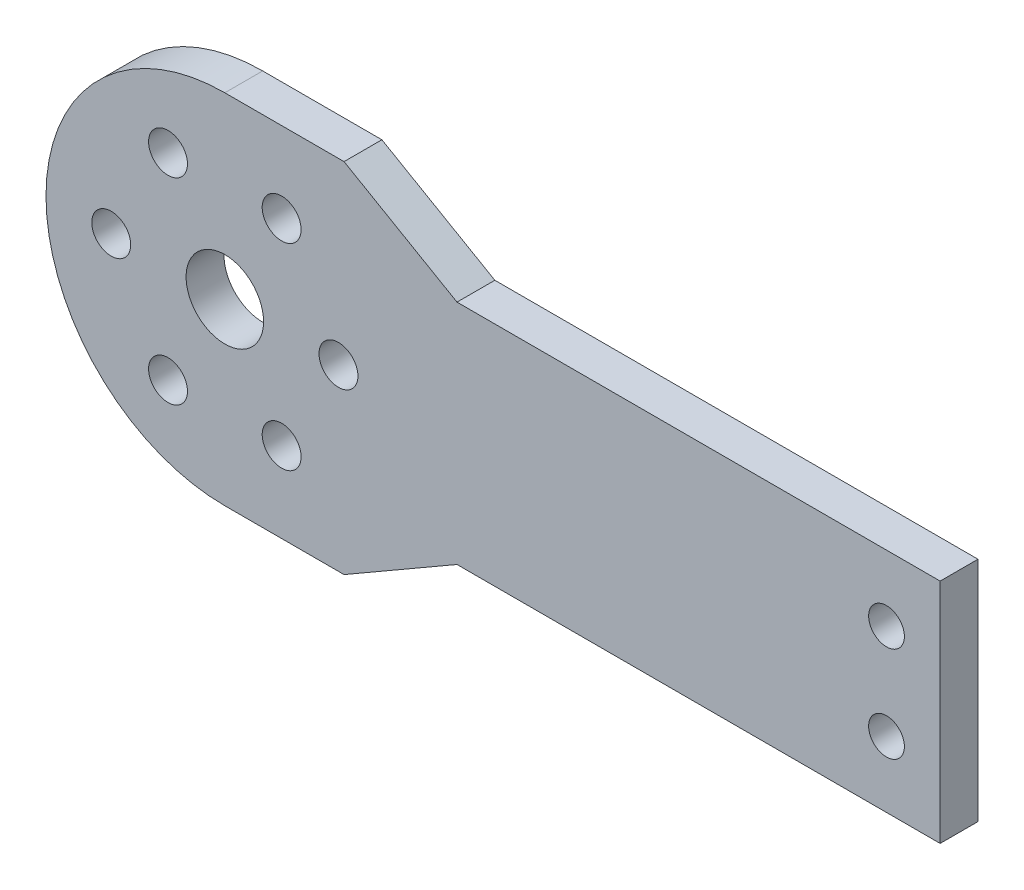
ISO-10303-21;
HEADER;
FILE_DESCRIPTION(('STEP AP214'),'2;1');
FILE_NAME('part.step','',(''),(''),'','','');
FILE_SCHEMA(('AUTOMOTIVE_DESIGN { 1 0 10303 214 1 1 1 1 }'));
ENDSEC;
DATA;
#1=APPLICATION_CONTEXT('core data for automotive mechanical design processes');
#2=APPLICATION_PROTOCOL_DEFINITION('international standard','automotive_design',2000,#1);
#3=PRODUCT_CONTEXT('',#1,'mechanical');
#4=PRODUCT('Part','Part','',(#3));
#5=PRODUCT_RELATED_PRODUCT_CATEGORY('part','',(#4));
#6=PRODUCT_DEFINITION_FORMATION('','',#4);
#7=PRODUCT_DEFINITION_CONTEXT('part definition',#1,'design');
#8=PRODUCT_DEFINITION('design','',#6,#7);
#9=PRODUCT_DEFINITION_SHAPE('','',#8);
#10=(LENGTH_UNIT() NAMED_UNIT(*) SI_UNIT(.MILLI.,.METRE.));
#11=(NAMED_UNIT(*) PLANE_ANGLE_UNIT() SI_UNIT($,.RADIAN.));
#12=(NAMED_UNIT(*) SI_UNIT($,.STERADIAN.) SOLID_ANGLE_UNIT());
#13=UNCERTAINTY_MEASURE_WITH_UNIT(LENGTH_MEASURE(1.E-05),#10,'distance_accuracy_value','');
#14=(GEOMETRIC_REPRESENTATION_CONTEXT(3) GLOBAL_UNCERTAINTY_ASSIGNED_CONTEXT((#13)) GLOBAL_UNIT_ASSIGNED_CONTEXT((#10,
#11,#12)) REPRESENTATION_CONTEXT('',''));
#15=CARTESIAN_POINT('',(0.,0.,0.));
#16=DIRECTION('',(0.,0.,1.));
#17=DIRECTION('',(1.,0.,0.));
#18=AXIS2_PLACEMENT_3D('',#15,#16,#17);
#19=CARTESIAN_POINT('',(0.,0.,89.3789074823255));
#20=DIRECTION('',(0.,0.,1.));
#21=DIRECTION('',(1.,0.,0.));
#22=AXIS2_PLACEMENT_3D('',#19,#20,#21);
#23=PLANE('',#22);
#24=CARTESIAN_POINT('',(9.53000000000001,0.,89.3789074823255));
#25=DIRECTION('',(0.,0.,1.));
#26=DIRECTION('',(1.,0.,0.));
#27=AXIS2_PLACEMENT_3D('',#24,#25,#26);
#28=CIRCLE('',#27,1.63194999999999);
#29=CARTESIAN_POINT('',(11.16195,0.,89.3789074823255));
#30=VERTEX_POINT('',#29);
#31=EDGE_CURVE('E195',#30,#30,#28,.T.);
#32=ORIENTED_EDGE('',*,*,#31,.F.);
#33=EDGE_LOOP('',(#32));
#34=FACE_BOUND('',#33,.T.);
#35=CARTESIAN_POINT('',(4.76500000000001,-8.25322209806569,89.3789074823255));
#36=DIRECTION('',(0.,0.,1.));
#37=DIRECTION('',(1.,0.,0.));
#38=AXIS2_PLACEMENT_3D('',#35,#36,#37);
#39=CIRCLE('',#38,1.63194999999999);
#40=CARTESIAN_POINT('',(6.39695,-8.25322209806569,89.3789074823255));
#41=VERTEX_POINT('',#40);
#42=EDGE_CURVE('E185',#41,#41,#39,.T.);
#43=ORIENTED_EDGE('',*,*,#42,.F.);
#44=EDGE_LOOP('',(#43));
#45=FACE_BOUND('',#44,.T.);
#46=CARTESIAN_POINT('',(-4.76499999999998,-8.2532220980657,89.3789074823255));
#47=DIRECTION('',(0.,0.,1.));
#48=DIRECTION('',(1.,0.,0.));
#49=AXIS2_PLACEMENT_3D('',#46,#47,#48);
#50=CIRCLE('',#49,1.63194999999999);
#51=CARTESIAN_POINT('',(-3.13304999999999,-8.2532220980657,89.3789074823255));
#52=VERTEX_POINT('',#51);
#53=EDGE_CURVE('E182',#52,#52,#50,.T.);
#54=ORIENTED_EDGE('',*,*,#53,.F.);
#55=EDGE_LOOP('',(#54));
#56=FACE_BOUND('',#55,.T.);
#57=CARTESIAN_POINT('',(-9.52999999999998,0.,89.3789074823255));
#58=DIRECTION('',(0.,0.,1.));
#59=DIRECTION('',(1.,0.,0.));
#60=AXIS2_PLACEMENT_3D('',#57,#58,#59);
#61=CIRCLE('',#60,1.63194999999999);
#62=CARTESIAN_POINT('',(-7.89804999999999,0.,89.3789074823255));
#63=VERTEX_POINT('',#62);
#64=EDGE_CURVE('E179',#63,#63,#61,.T.);
#65=ORIENTED_EDGE('',*,*,#64,.F.);
#66=EDGE_LOOP('',(#65));
#67=FACE_BOUND('',#66,.T.);
#68=CARTESIAN_POINT('',(-4.76499999999999,8.2532220980657,89.3789074823255));
#69=DIRECTION('',(0.,0.,1.));
#70=DIRECTION('',(1.,0.,0.));
#71=AXIS2_PLACEMENT_3D('',#68,#69,#70);
#72=CIRCLE('',#71,1.63194999999999);
#73=CARTESIAN_POINT('',(-3.13305,8.2532220980657,89.3789074823255));
#74=VERTEX_POINT('',#73);
#75=EDGE_CURVE('E175',#74,#74,#72,.T.);
#76=ORIENTED_EDGE('',*,*,#75,.F.);
#77=EDGE_LOOP('',(#76));
#78=FACE_BOUND('',#77,.T.);
#79=CARTESIAN_POINT('',(4.76500000000002,8.25322209806569,89.3789074823255));
#80=DIRECTION('',(0.,0.,1.));
#81=DIRECTION('',(1.,0.,0.));
#82=AXIS2_PLACEMENT_3D('',#79,#80,#81);
#83=CIRCLE('',#82,1.63194999999999);
#84=CARTESIAN_POINT('',(6.39695000000001,8.25322209806569,89.3789074823255));
#85=VERTEX_POINT('',#84);
#86=EDGE_CURVE('E171',#85,#85,#83,.T.);
#87=ORIENTED_EDGE('',*,*,#86,.F.);
#88=EDGE_LOOP('',(#87));
#89=FACE_BOUND('',#88,.T.);
#90=CARTESIAN_POINT('',(0.,0.,89.3789074823255));
#91=DIRECTION('',(0.,0.,1.));
#92=DIRECTION('',(1.,0.,0.));
#93=AXIS2_PLACEMENT_3D('',#90,#91,#92);
#94=CIRCLE('',#93,3.25);
#95=CARTESIAN_POINT('',(3.24999999999999,0.,89.3789074823255));
#96=VERTEX_POINT('',#95);
#97=EDGE_CURVE('E210',#96,#96,#94,.T.);
#98=ORIENTED_EDGE('',*,*,#97,.F.);
#99=EDGE_LOOP('',(#98));
#100=FACE_BOUND('',#99,.T.);
#101=CARTESIAN_POINT('',(0.,0.,89.3789074823255));
#102=DIRECTION('',(0.,0.,1.));
#103=DIRECTION('',(1.,0.,0.));
#104=AXIS2_PLACEMENT_3D('',#101,#102,#103);
#105=CIRCLE('',#104,15.);
#106=CARTESIAN_POINT('',(0.,15.,89.3789074823255));
#107=VERTEX_POINT('',#106);
#108=CARTESIAN_POINT('',(0.,-15.,89.3789074823255));
#109=VERTEX_POINT('',#108);
#110=EDGE_CURVE('E155',#107,#109,#105,.T.);
#111=ORIENTED_EDGE('',*,*,#110,.T.);
#112=DIRECTION('',(1.,0.,0.));
#113=VECTOR('',#112,1.);
#114=CARTESIAN_POINT('',(0.,-15.,89.3789074823255));
#115=LINE('',#114,#113);
#116=CARTESIAN_POINT('',(9.99999999999999,-15.,89.3789074823255));
#117=VERTEX_POINT('',#116);
#118=EDGE_CURVE('E103',#109,#117,#115,.T.);
#119=ORIENTED_EDGE('',*,*,#118,.T.);
#120=DIRECTION('',(0.866025403784438,0.500000000000001,0.));
#121=VECTOR('',#120,1.);
#122=CARTESIAN_POINT('',(9.99999999999999,-15.,89.3789074823255));
#123=LINE('',#122,#121);
#124=CARTESIAN_POINT('',(19.4743179174017,-9.53,89.3789074823255));
#125=VERTEX_POINT('',#124);
#126=EDGE_CURVE('E222',#117,#125,#123,.T.);
#127=ORIENTED_EDGE('',*,*,#126,.T.);
#128=DIRECTION('',(1.,0.,0.));
#129=VECTOR('',#128,1.);
#130=CARTESIAN_POINT('',(19.4743179174017,-9.53,89.3789074823255));
#131=LINE('',#130,#129);
#132=CARTESIAN_POINT('',(60.,-9.52999999999999,89.3789074823255));
#133=VERTEX_POINT('',#132);
#134=EDGE_CURVE('E224',#125,#133,#131,.T.);
#135=ORIENTED_EDGE('',*,*,#134,.T.);
#136=DIRECTION('',(0.,1.,0.));
#137=VECTOR('',#136,1.);
#138=CARTESIAN_POINT('',(60.,-9.52999999999999,89.3789074823255));
#139=LINE('',#138,#137);
#140=CARTESIAN_POINT('',(60.,9.53,89.3789074823255));
#141=VERTEX_POINT('',#140);
#142=EDGE_CURVE('E122',#133,#141,#139,.T.);
#143=ORIENTED_EDGE('',*,*,#142,.T.);
#144=DIRECTION('',(-1.,0.,0.));
#145=VECTOR('',#144,1.);
#146=CARTESIAN_POINT('',(60.,9.53,89.3789074823255));
#147=LINE('',#146,#145);
#148=CARTESIAN_POINT('',(19.4743179174017,9.53,89.3789074823255));
#149=VERTEX_POINT('',#148);
#150=EDGE_CURVE('E116',#141,#149,#147,.T.);
#151=ORIENTED_EDGE('',*,*,#150,.T.);
#152=DIRECTION('',(-0.866025403784438,0.500000000000001,0.));
#153=VECTOR('',#152,1.);
#154=CARTESIAN_POINT('',(19.4743179174017,9.53,89.3789074823255));
#155=LINE('',#154,#153);
#156=CARTESIAN_POINT('',(9.99999999999999,15.,89.3789074823255));
#157=VERTEX_POINT('',#156);
#158=EDGE_CURVE('E120',#149,#157,#155,.T.);
#159=ORIENTED_EDGE('',*,*,#158,.T.);
#160=DIRECTION('',(-1.,0.,0.));
#161=VECTOR('',#160,1.);
#162=CARTESIAN_POINT('',(9.99999999999999,15.,89.3789074823255));
#163=LINE('',#162,#161);
#164=EDGE_CURVE('E60',#157,#107,#163,.T.);
#165=ORIENTED_EDGE('',*,*,#164,.T.);
#166=EDGE_LOOP('',(#111,#119,#127,#135,#143,#151,#159,#165));
#167=FACE_BOUND('',#166,.T.);
#168=CARTESIAN_POINT('',(55.5,4.,89.3789074823255));
#169=DIRECTION('',(0.,0.,1.));
#170=DIRECTION('',(1.,0.,0.));
#171=AXIS2_PLACEMENT_3D('',#168,#169,#170);
#172=CIRCLE('',#171,1.5);
#173=CARTESIAN_POINT('',(57.,4.,89.3789074823255));
#174=VERTEX_POINT('',#173);
#175=EDGE_CURVE('E144',#174,#174,#172,.T.);
#176=ORIENTED_EDGE('',*,*,#175,.F.);
#177=EDGE_LOOP('',(#176));
#178=FACE_BOUND('',#177,.T.);
#179=CARTESIAN_POINT('',(55.5,-4.,89.3789074823255));
#180=DIRECTION('',(0.,0.,1.));
#181=DIRECTION('',(1.,0.,0.));
#182=AXIS2_PLACEMENT_3D('',#179,#180,#181);
#183=CIRCLE('',#182,1.5);
#184=CARTESIAN_POINT('',(57.,-4.,89.3789074823255));
#185=VERTEX_POINT('',#184);
#186=EDGE_CURVE('E204',#185,#185,#183,.T.);
#187=ORIENTED_EDGE('',*,*,#186,.F.);
#188=EDGE_LOOP('',(#187));
#189=FACE_BOUND('',#188,.T.);
#190=ADVANCED_FACE('F41',(#34,#45,#56,#67,#78,#89,#100,#167,#178,#189),#23,.T.);
#191=CARTESIAN_POINT('',(0.,0.,86.2039074823255));
#192=DIRECTION('',(0.,0.,1.));
#193=DIRECTION('',(1.,0.,0.));
#194=AXIS2_PLACEMENT_3D('',#191,#192,#193);
#195=PLANE('',#194);
#196=CARTESIAN_POINT('',(9.53000000000001,0.,86.2039074823255));
#197=DIRECTION('',(0.,0.,1.));
#198=DIRECTION('',(1.,0.,0.));
#199=AXIS2_PLACEMENT_3D('',#196,#197,#198);
#200=CIRCLE('',#199,1.63194999999999);
#201=CARTESIAN_POINT('',(11.16195,0.,86.2039074823255));
#202=VERTEX_POINT('',#201);
#203=EDGE_CURVE('E45',#202,#202,#200,.T.);
#204=ORIENTED_EDGE('',*,*,#203,.T.);
#205=EDGE_LOOP('',(#204));
#206=FACE_BOUND('',#205,.T.);
#207=CARTESIAN_POINT('',(4.76500000000001,-8.25322209806569,86.2039074823255));
#208=DIRECTION('',(0.,0.,1.));
#209=DIRECTION('',(1.,0.,0.));
#210=AXIS2_PLACEMENT_3D('',#207,#208,#209);
#211=CIRCLE('',#210,1.63194999999999);
#212=CARTESIAN_POINT('',(6.39694999999999,-8.25322209806569,86.2039074823255));
#213=VERTEX_POINT('',#212);
#214=EDGE_CURVE('E183',#213,#213,#211,.T.);
#215=ORIENTED_EDGE('',*,*,#214,.T.);
#216=EDGE_LOOP('',(#215));
#217=FACE_BOUND('',#216,.T.);
#218=CARTESIAN_POINT('',(-4.76499999999998,-8.2532220980657,86.2039074823255));
#219=DIRECTION('',(0.,0.,1.));
#220=DIRECTION('',(1.,0.,0.));
#221=AXIS2_PLACEMENT_3D('',#218,#219,#220);
#222=CIRCLE('',#221,1.63194999999999);
#223=CARTESIAN_POINT('',(-3.13304999999999,-8.2532220980657,86.2039074823255));
#224=VERTEX_POINT('',#223);
#225=EDGE_CURVE('E180',#224,#224,#222,.T.);
#226=ORIENTED_EDGE('',*,*,#225,.T.);
#227=EDGE_LOOP('',(#226));
#228=FACE_BOUND('',#227,.T.);
#229=CARTESIAN_POINT('',(-9.52999999999998,0.,86.2039074823255));
#230=DIRECTION('',(0.,0.,1.));
#231=DIRECTION('',(1.,0.,0.));
#232=AXIS2_PLACEMENT_3D('',#229,#230,#231);
#233=CIRCLE('',#232,1.63194999999999);
#234=CARTESIAN_POINT('',(-7.89804999999999,0.,86.2039074823255));
#235=VERTEX_POINT('',#234);
#236=EDGE_CURVE('E176',#235,#235,#233,.T.);
#237=ORIENTED_EDGE('',*,*,#236,.T.);
#238=EDGE_LOOP('',(#237));
#239=FACE_BOUND('',#238,.T.);
#240=CARTESIAN_POINT('',(-4.76499999999999,8.2532220980657,86.2039074823255));
#241=DIRECTION('',(0.,0.,1.));
#242=DIRECTION('',(1.,0.,0.));
#243=AXIS2_PLACEMENT_3D('',#240,#241,#242);
#244=CIRCLE('',#243,1.63194999999999);
#245=CARTESIAN_POINT('',(-3.13305,8.2532220980657,86.2039074823255));
#246=VERTEX_POINT('',#245);
#247=EDGE_CURVE('E172',#246,#246,#244,.T.);
#248=ORIENTED_EDGE('',*,*,#247,.T.);
#249=EDGE_LOOP('',(#248));
#250=FACE_BOUND('',#249,.T.);
#251=CARTESIAN_POINT('',(4.76500000000002,8.25322209806569,86.2039074823255));
#252=DIRECTION('',(0.,0.,1.));
#253=DIRECTION('',(1.,0.,0.));
#254=AXIS2_PLACEMENT_3D('',#251,#252,#253);
#255=CIRCLE('',#254,1.63194999999999);
#256=CARTESIAN_POINT('',(6.39695000000001,8.25322209806569,86.2039074823255));
#257=VERTEX_POINT('',#256);
#258=EDGE_CURVE('E167',#257,#257,#255,.T.);
#259=ORIENTED_EDGE('',*,*,#258,.T.);
#260=EDGE_LOOP('',(#259));
#261=FACE_BOUND('',#260,.T.);
#262=CARTESIAN_POINT('',(0.,0.,86.2039074823255));
#263=DIRECTION('',(0.,0.,1.));
#264=DIRECTION('',(1.,0.,0.));
#265=AXIS2_PLACEMENT_3D('',#262,#263,#264);
#266=CIRCLE('',#265,15.);
#267=CARTESIAN_POINT('',(0.,15.,86.2039074823255));
#268=VERTEX_POINT('',#267);
#269=CARTESIAN_POINT('',(0.,-15.,86.2039074823255));
#270=VERTEX_POINT('',#269);
#271=EDGE_CURVE('E140',#268,#270,#266,.T.);
#272=ORIENTED_EDGE('',*,*,#271,.F.);
#273=DIRECTION('',(-1.,0.,0.));
#274=VECTOR('',#273,1.);
#275=CARTESIAN_POINT('',(9.99999999999999,15.,86.2039074823255));
#276=LINE('',#275,#274);
#277=CARTESIAN_POINT('',(9.99999999999999,15.,86.2039074823255));
#278=VERTEX_POINT('',#277);
#279=EDGE_CURVE('E95',#278,#268,#276,.T.);
#280=ORIENTED_EDGE('',*,*,#279,.F.);
#281=DIRECTION('',(-0.866025403784438,0.500000000000001,0.));
#282=VECTOR('',#281,1.);
#283=CARTESIAN_POINT('',(19.4743179174017,9.53,86.2039074823255));
#284=LINE('',#283,#282);
#285=CARTESIAN_POINT('',(19.4743179174017,9.53,86.2039074823255));
#286=VERTEX_POINT('',#285);
#287=EDGE_CURVE('E89',#286,#278,#284,.T.);
#288=ORIENTED_EDGE('',*,*,#287,.F.);
#289=DIRECTION('',(-1.,0.,0.));
#290=VECTOR('',#289,1.);
#291=CARTESIAN_POINT('',(60.,9.53,86.2039074823255));
#292=LINE('',#291,#290);
#293=CARTESIAN_POINT('',(60.,9.53,86.2039074823255));
#294=VERTEX_POINT('',#293);
#295=EDGE_CURVE('E130',#294,#286,#292,.T.);
#296=ORIENTED_EDGE('',*,*,#295,.F.);
#297=DIRECTION('',(0.,1.,0.));
#298=VECTOR('',#297,1.);
#299=CARTESIAN_POINT('',(60.,-9.52999999999999,86.2039074823255));
#300=LINE('',#299,#298);
#301=CARTESIAN_POINT('',(60.,-9.52999999999999,86.2039074823255));
#302=VERTEX_POINT('',#301);
#303=EDGE_CURVE('E150',#302,#294,#300,.T.);
#304=ORIENTED_EDGE('',*,*,#303,.F.);
#305=DIRECTION('',(1.,0.,0.));
#306=VECTOR('',#305,1.);
#307=CARTESIAN_POINT('',(19.4743179174017,-9.53,86.2039074823255));
#308=LINE('',#307,#306);
#309=CARTESIAN_POINT('',(19.4743179174017,-9.53,86.2039074823255));
#310=VERTEX_POINT('',#309);
#311=EDGE_CURVE('E148',#310,#302,#308,.T.);
#312=ORIENTED_EDGE('',*,*,#311,.F.);
#313=DIRECTION('',(0.866025403784438,0.500000000000001,0.));
#314=VECTOR('',#313,1.);
#315=CARTESIAN_POINT('',(9.99999999999999,-15.,86.2039074823255));
#316=LINE('',#315,#314);
#317=CARTESIAN_POINT('',(9.99999999999999,-15.,86.2039074823255));
#318=VERTEX_POINT('',#317);
#319=EDGE_CURVE('E146',#318,#310,#316,.T.);
#320=ORIENTED_EDGE('',*,*,#319,.F.);
#321=DIRECTION('',(1.,0.,0.));
#322=VECTOR('',#321,1.);
#323=CARTESIAN_POINT('',(0.,-15.,86.2039074823255));
#324=LINE('',#323,#322);
#325=EDGE_CURVE('E143',#270,#318,#324,.T.);
#326=ORIENTED_EDGE('',*,*,#325,.F.);
#327=EDGE_LOOP('',(#272,#280,#288,#296,#304,#312,#320,#326));
#328=FACE_BOUND('',#327,.T.);
#329=CARTESIAN_POINT('',(55.5,4.,86.2039074823255));
#330=DIRECTION('',(0.,0.,1.));
#331=DIRECTION('',(1.,0.,0.));
#332=AXIS2_PLACEMENT_3D('',#329,#330,#331);
#333=CIRCLE('',#332,1.5);
#334=CARTESIAN_POINT('',(57.,4.,86.2039074823255));
#335=VERTEX_POINT('',#334);
#336=EDGE_CURVE('E213',#335,#335,#333,.T.);
#337=ORIENTED_EDGE('',*,*,#336,.T.);
#338=EDGE_LOOP('',(#337));
#339=FACE_BOUND('',#338,.T.);
#340=CARTESIAN_POINT('',(0.,0.,86.2039074823255));
#341=DIRECTION('',(0.,0.,1.));
#342=DIRECTION('',(1.,0.,0.));
#343=AXIS2_PLACEMENT_3D('',#340,#341,#342);
#344=CIRCLE('',#343,3.25);
#345=CARTESIAN_POINT('',(3.24999999999999,0.,86.2039074823255));
#346=VERTEX_POINT('',#345);
#347=EDGE_CURVE('E207',#346,#346,#344,.T.);
#348=ORIENTED_EDGE('',*,*,#347,.T.);
#349=EDGE_LOOP('',(#348));
#350=FACE_BOUND('',#349,.T.);
#351=CARTESIAN_POINT('',(55.5,-4.,86.2039074823255));
#352=DIRECTION('',(0.,0.,1.));
#353=DIRECTION('',(1.,0.,0.));
#354=AXIS2_PLACEMENT_3D('',#351,#352,#353);
#355=CIRCLE('',#354,1.5);
#356=CARTESIAN_POINT('',(57.,-4.,86.2039074823255));
#357=VERTEX_POINT('',#356);
#358=EDGE_CURVE('E170',#357,#357,#355,.T.);
#359=ORIENTED_EDGE('',*,*,#358,.T.);
#360=EDGE_LOOP('',(#359));
#361=FACE_BOUND('',#360,.T.);
#362=ADVANCED_FACE('F237',(#206,#217,#228,#239,#250,#261,#328,#339,#350,#361),#195,.F.);
#363=CARTESIAN_POINT('',(0.,0.,89.3789074823255));
#364=DIRECTION('',(0.,0.,-1.));
#365=DIRECTION('',(-1.,0.,0.));
#366=AXIS2_PLACEMENT_3D('',#363,#364,#365);
#367=CYLINDRICAL_SURFACE('',#366,15.);
#368=ORIENTED_EDGE('',*,*,#271,.T.);
#369=DIRECTION('',(0.,0.,-1.));
#370=VECTOR('',#369,1.);
#371=CARTESIAN_POINT('',(0.,-15.,89.3789074823255));
#372=LINE('',#371,#370);
#373=EDGE_CURVE('E11',#109,#270,#372,.T.);
#374=ORIENTED_EDGE('',*,*,#373,.F.);
#375=ORIENTED_EDGE('',*,*,#110,.F.);
#376=DIRECTION('',(0.,0.,-1.));
#377=VECTOR('',#376,1.);
#378=CARTESIAN_POINT('',(0.,15.,89.3789074823255));
#379=LINE('',#378,#377);
#380=EDGE_CURVE('E136',#107,#268,#379,.T.);
#381=ORIENTED_EDGE('',*,*,#380,.T.);
#382=EDGE_LOOP('',(#368,#374,#375,#381));
#383=FACE_BOUND('',#382,.T.);
#384=ADVANCED_FACE('F43',(#383),#367,.T.);
#385=CARTESIAN_POINT('',(0.,-15.,89.3789074823255));
#386=DIRECTION('',(0.,1.,0.));
#387=DIRECTION('',(0.,0.,1.));
#388=AXIS2_PLACEMENT_3D('',#385,#386,#387);
#389=PLANE('',#388);
#390=ORIENTED_EDGE('',*,*,#325,.T.);
#391=DIRECTION('',(0.,0.,-1.));
#392=VECTOR('',#391,1.);
#393=CARTESIAN_POINT('',(9.99999999999999,-15.,89.3789074823255));
#394=LINE('',#393,#392);
#395=EDGE_CURVE('E51',#117,#318,#394,.T.);
#396=ORIENTED_EDGE('',*,*,#395,.F.);
#397=ORIENTED_EDGE('',*,*,#118,.F.);
#398=ORIENTED_EDGE('',*,*,#373,.T.);
#399=EDGE_LOOP('',(#390,#396,#397,#398));
#400=FACE_BOUND('',#399,.T.);
#401=ADVANCED_FACE('F356',(#400),#389,.F.);
#402=CARTESIAN_POINT('',(9.99999999999999,-15.,89.3789074823255));
#403=DIRECTION('',(-0.500000000000001,0.866025403784438,0.));
#404=DIRECTION('',(-0.866025403784438,-0.500000000000001,0.));
#405=AXIS2_PLACEMENT_3D('',#402,#403,#404);
#406=PLANE('',#405);
#407=ORIENTED_EDGE('',*,*,#319,.T.);
#408=DIRECTION('',(0.,0.,-1.));
#409=VECTOR('',#408,1.);
#410=CARTESIAN_POINT('',(19.4743179174017,-9.53,89.3789074823255));
#411=LINE('',#410,#409);
#412=EDGE_CURVE('E162',#125,#310,#411,.T.);
#413=ORIENTED_EDGE('',*,*,#412,.F.);
#414=ORIENTED_EDGE('',*,*,#126,.F.);
#415=ORIENTED_EDGE('',*,*,#395,.T.);
#416=EDGE_LOOP('',(#407,#413,#414,#415));
#417=FACE_BOUND('',#416,.T.);
#418=ADVANCED_FACE('F364',(#417),#406,.F.);
#419=CARTESIAN_POINT('',(19.4743179174017,-9.53,89.3789074823255));
#420=DIRECTION('',(0.,1.,0.));
#421=DIRECTION('',(-1.,0.,0.));
#422=AXIS2_PLACEMENT_3D('',#419,#420,#421);
#423=PLANE('',#422);
#424=ORIENTED_EDGE('',*,*,#311,.T.);
#425=DIRECTION('',(0.,0.,-1.));
#426=VECTOR('',#425,1.);
#427=CARTESIAN_POINT('',(60.,-9.52999999999999,89.3789074823255));
#428=LINE('',#427,#426);
#429=EDGE_CURVE('E159',#133,#302,#428,.T.);
#430=ORIENTED_EDGE('',*,*,#429,.F.);
#431=ORIENTED_EDGE('',*,*,#134,.F.);
#432=ORIENTED_EDGE('',*,*,#412,.T.);
#433=EDGE_LOOP('',(#424,#430,#431,#432));
#434=FACE_BOUND('',#433,.T.);
#435=ADVANCED_FACE('F230',(#434),#423,.F.);
#436=CARTESIAN_POINT('',(60.,-9.52999999999999,89.3789074823255));
#437=DIRECTION('',(-1.,0.,0.));
#438=DIRECTION('',(0.,0.,1.));
#439=AXIS2_PLACEMENT_3D('',#436,#437,#438);
#440=PLANE('',#439);
#441=ORIENTED_EDGE('',*,*,#303,.T.);
#442=DIRECTION('',(0.,0.,-1.));
#443=VECTOR('',#442,1.);
#444=CARTESIAN_POINT('',(60.,9.53,89.3789074823255));
#445=LINE('',#444,#443);
#446=EDGE_CURVE('E131',#141,#294,#445,.T.);
#447=ORIENTED_EDGE('',*,*,#446,.F.);
#448=ORIENTED_EDGE('',*,*,#142,.F.);
#449=ORIENTED_EDGE('',*,*,#429,.T.);
#450=EDGE_LOOP('',(#441,#447,#448,#449));
#451=FACE_BOUND('',#450,.T.);
#452=ADVANCED_FACE('F234',(#451),#440,.F.);
#453=CARTESIAN_POINT('',(60.,9.53,89.3789074823255));
#454=DIRECTION('',(0.,-1.,0.));
#455=DIRECTION('',(0.,0.,-1.));
#456=AXIS2_PLACEMENT_3D('',#453,#454,#455);
#457=PLANE('',#456);
#458=ORIENTED_EDGE('',*,*,#295,.T.);
#459=DIRECTION('',(0.,0.,-1.));
#460=VECTOR('',#459,1.);
#461=CARTESIAN_POINT('',(19.4743179174017,9.53,89.3789074823255));
#462=LINE('',#461,#460);
#463=EDGE_CURVE('E127',#149,#286,#462,.T.);
#464=ORIENTED_EDGE('',*,*,#463,.F.);
#465=ORIENTED_EDGE('',*,*,#150,.F.);
#466=ORIENTED_EDGE('',*,*,#446,.T.);
#467=EDGE_LOOP('',(#458,#464,#465,#466));
#468=FACE_BOUND('',#467,.T.);
#469=ADVANCED_FACE('F128',(#468),#457,.F.);
#470=CARTESIAN_POINT('',(19.4743179174017,9.53,89.3789074823255));
#471=DIRECTION('',(-0.500000000000001,-0.866025403784438,0.));
#472=DIRECTION('',(0.866025403784438,-0.500000000000001,0.));
#473=AXIS2_PLACEMENT_3D('',#470,#471,#472);
#474=PLANE('',#473);
#475=ORIENTED_EDGE('',*,*,#287,.T.);
#476=DIRECTION('',(0.,0.,-1.));
#477=VECTOR('',#476,1.);
#478=CARTESIAN_POINT('',(9.99999999999999,15.,89.3789074823255));
#479=LINE('',#478,#477);
#480=EDGE_CURVE('E132',#157,#278,#479,.T.);
#481=ORIENTED_EDGE('',*,*,#480,.F.);
#482=ORIENTED_EDGE('',*,*,#158,.F.);
#483=ORIENTED_EDGE('',*,*,#463,.T.);
#484=EDGE_LOOP('',(#475,#481,#482,#483));
#485=FACE_BOUND('',#484,.T.);
#486=ADVANCED_FACE('F134',(#485),#474,.F.);
#487=CARTESIAN_POINT('',(9.99999999999999,15.,89.3789074823255));
#488=DIRECTION('',(0.,-1.,0.));
#489=DIRECTION('',(0.,0.,-1.));
#490=AXIS2_PLACEMENT_3D('',#487,#488,#489);
#491=PLANE('',#490);
#492=ORIENTED_EDGE('',*,*,#279,.T.);
#493=ORIENTED_EDGE('',*,*,#380,.F.);
#494=ORIENTED_EDGE('',*,*,#164,.F.);
#495=ORIENTED_EDGE('',*,*,#480,.T.);
#496=EDGE_LOOP('',(#492,#493,#494,#495));
#497=FACE_BOUND('',#496,.T.);
#498=ADVANCED_FACE('F243',(#497),#491,.F.);
#499=CARTESIAN_POINT('',(55.5,4.,89.3789074823255));
#500=DIRECTION('',(0.,0.,-1.));
#501=DIRECTION('',(-1.,0.,0.));
#502=AXIS2_PLACEMENT_3D('',#499,#500,#501);
#503=CYLINDRICAL_SURFACE('',#502,1.5);
#504=ORIENTED_EDGE('',*,*,#175,.T.);
#505=EDGE_LOOP('',(#504));
#506=FACE_BOUND('',#505,.T.);
#507=ORIENTED_EDGE('',*,*,#336,.F.);
#508=EDGE_LOOP('',(#507));
#509=FACE_BOUND('',#508,.T.);
#510=ADVANCED_FACE('F245',(#506,#509),#503,.F.);
#511=CARTESIAN_POINT('',(0.,0.,89.3789074823255));
#512=DIRECTION('',(0.,0.,-1.));
#513=DIRECTION('',(-1.,0.,0.));
#514=AXIS2_PLACEMENT_3D('',#511,#512,#513);
#515=CYLINDRICAL_SURFACE('',#514,3.25);
#516=ORIENTED_EDGE('',*,*,#97,.T.);
#517=EDGE_LOOP('',(#516));
#518=FACE_BOUND('',#517,.T.);
#519=ORIENTED_EDGE('',*,*,#347,.F.);
#520=EDGE_LOOP('',(#519));
#521=FACE_BOUND('',#520,.T.);
#522=ADVANCED_FACE('F251',(#518,#521),#515,.F.);
#523=CARTESIAN_POINT('',(55.5,-4.,89.3789074823255));
#524=DIRECTION('',(0.,0.,-1.));
#525=DIRECTION('',(-1.,0.,0.));
#526=AXIS2_PLACEMENT_3D('',#523,#524,#525);
#527=CYLINDRICAL_SURFACE('',#526,1.5);
#528=ORIENTED_EDGE('',*,*,#186,.T.);
#529=EDGE_LOOP('',(#528));
#530=FACE_BOUND('',#529,.T.);
#531=ORIENTED_EDGE('',*,*,#358,.F.);
#532=EDGE_LOOP('',(#531));
#533=FACE_BOUND('',#532,.T.);
#534=ADVANCED_FACE('F269',(#530,#533),#527,.F.);
#535=CARTESIAN_POINT('',(4.76500000000002,8.25322209806569,89.3789074823255));
#536=DIRECTION('',(0.,0.,1.));
#537=DIRECTION('',(1.,0.,0.));
#538=AXIS2_PLACEMENT_3D('',#535,#536,#537);
#539=CYLINDRICAL_SURFACE('',#538,1.63194999999999);
#540=ORIENTED_EDGE('',*,*,#86,.T.);
#541=EDGE_LOOP('',(#540));
#542=FACE_BOUND('',#541,.T.);
#543=ORIENTED_EDGE('',*,*,#258,.F.);
#544=EDGE_LOOP('',(#543));
#545=FACE_BOUND('',#544,.T.);
#546=ADVANCED_FACE('F272',(#542,#545),#539,.F.);
#547=CARTESIAN_POINT('',(-4.76499999999999,8.2532220980657,89.3789074823255));
#548=DIRECTION('',(0.,0.,1.));
#549=DIRECTION('',(1.,0.,0.));
#550=AXIS2_PLACEMENT_3D('',#547,#548,#549);
#551=CYLINDRICAL_SURFACE('',#550,1.63194999999999);
#552=ORIENTED_EDGE('',*,*,#75,.T.);
#553=EDGE_LOOP('',(#552));
#554=FACE_BOUND('',#553,.T.);
#555=ORIENTED_EDGE('',*,*,#247,.F.);
#556=EDGE_LOOP('',(#555));
#557=FACE_BOUND('',#556,.T.);
#558=ADVANCED_FACE('F276',(#554,#557),#551,.F.);
#559=CARTESIAN_POINT('',(-9.52999999999998,0.,89.3789074823255));
#560=DIRECTION('',(0.,0.,1.));
#561=DIRECTION('',(1.,0.,0.));
#562=AXIS2_PLACEMENT_3D('',#559,#560,#561);
#563=CYLINDRICAL_SURFACE('',#562,1.63194999999999);
#564=ORIENTED_EDGE('',*,*,#64,.T.);
#565=EDGE_LOOP('',(#564));
#566=FACE_BOUND('',#565,.T.);
#567=ORIENTED_EDGE('',*,*,#236,.F.);
#568=EDGE_LOOP('',(#567));
#569=FACE_BOUND('',#568,.T.);
#570=ADVANCED_FACE('F280',(#566,#569),#563,.F.);
#571=CARTESIAN_POINT('',(-4.76499999999998,-8.2532220980657,89.3789074823255));
#572=DIRECTION('',(0.,0.,1.));
#573=DIRECTION('',(1.,0.,0.));
#574=AXIS2_PLACEMENT_3D('',#571,#572,#573);
#575=CYLINDRICAL_SURFACE('',#574,1.63194999999999);
#576=ORIENTED_EDGE('',*,*,#53,.T.);
#577=EDGE_LOOP('',(#576));
#578=FACE_BOUND('',#577,.T.);
#579=ORIENTED_EDGE('',*,*,#225,.F.);
#580=EDGE_LOOP('',(#579));
#581=FACE_BOUND('',#580,.T.);
#582=ADVANCED_FACE('F284',(#578,#581),#575,.F.);
#583=CARTESIAN_POINT('',(4.76500000000001,-8.25322209806569,89.3789074823255));
#584=DIRECTION('',(0.,0.,1.));
#585=DIRECTION('',(1.,0.,0.));
#586=AXIS2_PLACEMENT_3D('',#583,#584,#585);
#587=CYLINDRICAL_SURFACE('',#586,1.63194999999999);
#588=ORIENTED_EDGE('',*,*,#42,.T.);
#589=EDGE_LOOP('',(#588));
#590=FACE_BOUND('',#589,.T.);
#591=ORIENTED_EDGE('',*,*,#214,.F.);
#592=EDGE_LOOP('',(#591));
#593=FACE_BOUND('',#592,.T.);
#594=ADVANCED_FACE('F288',(#590,#593),#587,.F.);
#595=CARTESIAN_POINT('',(9.53000000000001,0.,89.3789074823255));
#596=DIRECTION('',(0.,0.,1.));
#597=DIRECTION('',(1.,0.,0.));
#598=AXIS2_PLACEMENT_3D('',#595,#596,#597);
#599=CYLINDRICAL_SURFACE('',#598,1.63194999999999);
#600=ORIENTED_EDGE('',*,*,#31,.T.);
#601=EDGE_LOOP('',(#600));
#602=FACE_BOUND('',#601,.T.);
#603=ORIENTED_EDGE('',*,*,#203,.F.);
#604=EDGE_LOOP('',(#603));
#605=FACE_BOUND('',#604,.T.);
#606=ADVANCED_FACE('F292',(#602,#605),#599,.F.);
#607=CLOSED_SHELL('',(#190,#362,#384,#401,#418,#435,#452,#469,#486,#498,#510,#522,#534,#546,
#558,#570,#582,#594,#606));
#608=MANIFOLD_SOLID_BREP('B2',#607);
#609=ADVANCED_BREP_SHAPE_REPRESENTATION('',(#18,#608),#14);
#610=SHAPE_DEFINITION_REPRESENTATION(#9,#609);
ENDSEC;
END-ISO-10303-21;
